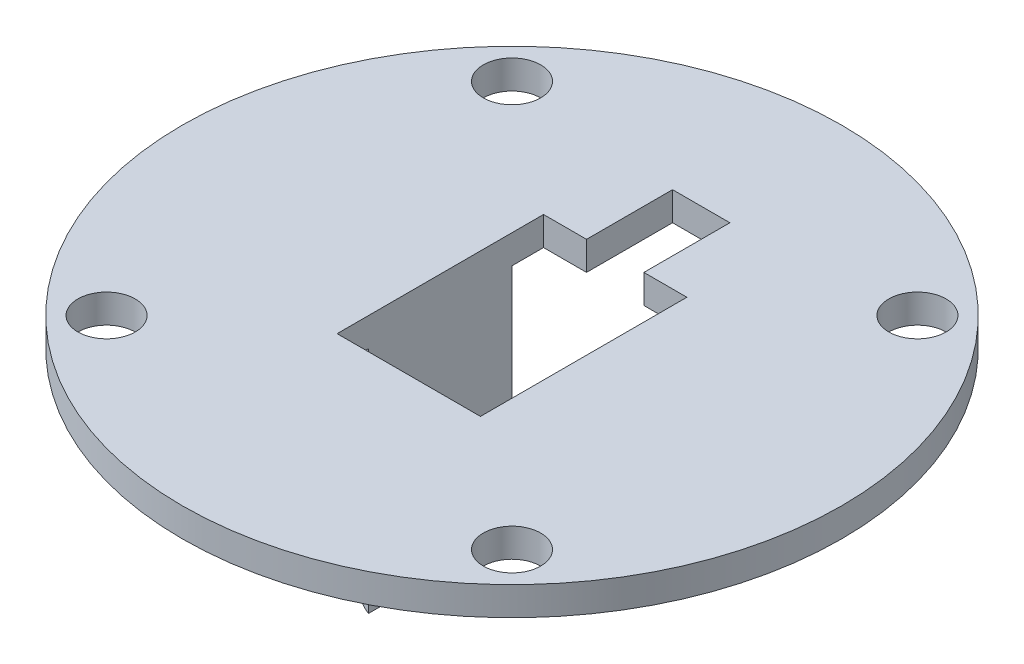
ISO-10303-21;
HEADER;
FILE_DESCRIPTION(('STEP AP214'),'2;1');
FILE_NAME('part.step','',(''),(''),'','','');
FILE_SCHEMA(('AUTOMOTIVE_DESIGN { 1 0 10303 214 1 1 1 1 }'));
ENDSEC;
DATA;
#1=APPLICATION_CONTEXT('core data for automotive mechanical design processes');
#2=APPLICATION_PROTOCOL_DEFINITION('international standard','automotive_design',2000,#1);
#3=PRODUCT_CONTEXT('',#1,'mechanical');
#4=PRODUCT('Part','Part','',(#3));
#5=PRODUCT_RELATED_PRODUCT_CATEGORY('part','',(#4));
#6=PRODUCT_DEFINITION_FORMATION('','',#4);
#7=PRODUCT_DEFINITION_CONTEXT('part definition',#1,'design');
#8=PRODUCT_DEFINITION('design','',#6,#7);
#9=PRODUCT_DEFINITION_SHAPE('','',#8);
#10=(LENGTH_UNIT() NAMED_UNIT(*) SI_UNIT(.MILLI.,.METRE.));
#11=(NAMED_UNIT(*) PLANE_ANGLE_UNIT() SI_UNIT($,.RADIAN.));
#12=(NAMED_UNIT(*) SI_UNIT($,.STERADIAN.) SOLID_ANGLE_UNIT());
#13=UNCERTAINTY_MEASURE_WITH_UNIT(LENGTH_MEASURE(1.E-05),#10,'distance_accuracy_value','');
#14=(GEOMETRIC_REPRESENTATION_CONTEXT(3) GLOBAL_UNCERTAINTY_ASSIGNED_CONTEXT((#13)) GLOBAL_UNIT_ASSIGNED_CONTEXT((#10,
#11,#12)) REPRESENTATION_CONTEXT('',''));
#15=CARTESIAN_POINT('',(0.,0.,0.));
#16=DIRECTION('',(0.,0.,1.));
#17=DIRECTION('',(1.,0.,0.));
#18=AXIS2_PLACEMENT_3D('',#15,#16,#17);
#19=CARTESIAN_POINT('',(-12.5,0.,-18.));
#20=DIRECTION('',(0.,0.,-1.));
#21=DIRECTION('',(-1.,0.,0.));
#22=AXIS2_PLACEMENT_3D('',#19,#20,#21);
#23=PLANE('',#22);
#24=DIRECTION('',(-1.,0.,0.));
#25=VECTOR('',#24,1.);
#26=CARTESIAN_POINT('',(-12.5,5.,-18.));
#27=LINE('',#26,#25);
#28=CARTESIAN_POINT('',(12.5,5.,-18.));
#29=VERTEX_POINT('',#28);
#30=CARTESIAN_POINT('',(5.,5.,-18.));
#31=VERTEX_POINT('',#30);
#32=EDGE_CURVE('E198',#29,#31,#27,.T.);
#33=ORIENTED_EDGE('',*,*,#32,.T.);
#34=DIRECTION('',(0.,-1.,0.));
#35=VECTOR('',#34,1.);
#36=CARTESIAN_POINT('',(5.,0.,-18.));
#37=LINE('',#36,#35);
#38=CARTESIAN_POINT('',(5.,0.,-18.));
#39=VERTEX_POINT('',#38);
#40=EDGE_CURVE('E11',#31,#39,#37,.T.);
#41=ORIENTED_EDGE('',*,*,#40,.T.);
#42=DIRECTION('',(-1.,0.,0.));
#43=VECTOR('',#42,1.);
#44=CARTESIAN_POINT('',(-12.5,0.,-18.));
#45=LINE('',#44,#43);
#46=CARTESIAN_POINT('',(12.5,0.,-18.));
#47=VERTEX_POINT('',#46);
#48=EDGE_CURVE('E186',#47,#39,#45,.T.);
#49=ORIENTED_EDGE('',*,*,#48,.F.);
#50=DIRECTION('',(0.,1.,0.));
#51=VECTOR('',#50,1.);
#52=CARTESIAN_POINT('',(12.5,0.,-18.));
#53=LINE('',#52,#51);
#54=EDGE_CURVE('E195',#47,#29,#53,.T.);
#55=ORIENTED_EDGE('',*,*,#54,.T.);
#56=EDGE_LOOP('',(#33,#41,#49,#55));
#57=FACE_BOUND('',#56,.T.);
#58=ADVANCED_FACE('F45',(#57),#23,.F.);
#59=CARTESIAN_POINT('',(0.,0.,0.));
#60=DIRECTION('',(0.,1.,0.));
#61=DIRECTION('',(0.,0.,1.));
#62=AXIS2_PLACEMENT_3D('',#59,#60,#61);
#63=PLANE('',#62);
#64=ORIENTED_EDGE('',*,*,#48,.T.);
#65=DIRECTION('',(0.,0.,-1.));
#66=VECTOR('',#65,1.);
#67=CARTESIAN_POINT('',(5.,0.,0.));
#68=LINE('',#67,#66);
#69=CARTESIAN_POINT('',(5.,0.,-33.));
#70=VERTEX_POINT('',#69);
#71=EDGE_CURVE('E164',#39,#70,#68,.T.);
#72=ORIENTED_EDGE('',*,*,#71,.T.);
#73=DIRECTION('',(-1.,0.,0.));
#74=VECTOR('',#73,1.);
#75=CARTESIAN_POINT('',(0.,0.,-33.));
#76=LINE('',#75,#74);
#77=CARTESIAN_POINT('',(-5.,0.,-33.));
#78=VERTEX_POINT('',#77);
#79=EDGE_CURVE('E142',#70,#78,#76,.T.);
#80=ORIENTED_EDGE('',*,*,#79,.T.);
#81=DIRECTION('',(0.,0.,1.));
#82=VECTOR('',#81,1.);
#83=CARTESIAN_POINT('',(-5.,0.,0.));
#84=LINE('',#83,#82);
#85=CARTESIAN_POINT('',(-5.,0.,-18.));
#86=VERTEX_POINT('',#85);
#87=EDGE_CURVE('E160',#78,#86,#84,.T.);
#88=ORIENTED_EDGE('',*,*,#87,.T.);
#89=CARTESIAN_POINT('',(-12.5,0.,-18.));
#90=VERTEX_POINT('',#89);
#91=EDGE_CURVE('E184',#86,#90,#45,.T.);
#92=ORIENTED_EDGE('',*,*,#91,.T.);
#93=DIRECTION('',(0.,0.,1.));
#94=VECTOR('',#93,1.);
#95=CARTESIAN_POINT('',(-12.5,0.,18.));
#96=LINE('',#95,#94);
#97=CARTESIAN_POINT('',(-12.5,0.,-12.5));
#98=VERTEX_POINT('',#97);
#99=EDGE_CURVE('E190',#90,#98,#96,.T.);
#100=ORIENTED_EDGE('',*,*,#99,.T.);
#101=CARTESIAN_POINT('',(-11.5,0.,-6.58392021690039));
#102=DIRECTION('',(0.,1.,0.));
#103=DIRECTION('',(0.,0.,1.));
#104=AXIS2_PLACEMENT_3D('',#101,#102,#103);
#105=CIRCLE('',#104,6.);
#106=CARTESIAN_POINT('',(-17.5,0.,-6.58392021690039));
#107=VERTEX_POINT('',#106);
#108=EDGE_CURVE('E249',#98,#107,#105,.T.);
#109=ORIENTED_EDGE('',*,*,#108,.T.);
#110=DIRECTION('',(0.,0.,-1.));
#111=VECTOR('',#110,1.);
#112=CARTESIAN_POINT('',(-17.5,0.,-12.5));
#113=LINE('',#112,#111);
#114=CARTESIAN_POINT('',(-17.5,0.,6.58392021690038));
#115=VERTEX_POINT('',#114);
#116=EDGE_CURVE('E172',#115,#107,#113,.T.);
#117=ORIENTED_EDGE('',*,*,#116,.F.);
#118=CARTESIAN_POINT('',(-11.5,0.,6.58392021690038));
#119=DIRECTION('',(0.,1.,0.));
#120=DIRECTION('',(0.,0.,1.));
#121=AXIS2_PLACEMENT_3D('',#118,#119,#120);
#122=CIRCLE('',#121,6.);
#123=CARTESIAN_POINT('',(-12.5,0.,12.5));
#124=VERTEX_POINT('',#123);
#125=EDGE_CURVE('E251',#115,#124,#122,.T.);
#126=ORIENTED_EDGE('',*,*,#125,.T.);
#127=CARTESIAN_POINT('',(-12.5,0.,18.));
#128=VERTEX_POINT('',#127);
#129=EDGE_CURVE('E189',#124,#128,#96,.T.);
#130=ORIENTED_EDGE('',*,*,#129,.T.);
#131=DIRECTION('',(1.,0.,0.));
#132=VECTOR('',#131,1.);
#133=CARTESIAN_POINT('',(-12.5,0.,18.));
#134=LINE('',#133,#132);
#135=CARTESIAN_POINT('',(12.5,0.,18.));
#136=VERTEX_POINT('',#135);
#137=EDGE_CURVE('E192',#128,#136,#134,.T.);
#138=ORIENTED_EDGE('',*,*,#137,.T.);
#139=DIRECTION('',(0.,0.,-1.));
#140=VECTOR('',#139,1.);
#141=CARTESIAN_POINT('',(12.5,0.,18.));
#142=LINE('',#141,#140);
#143=EDGE_CURVE('E181',#136,#47,#142,.T.);
#144=ORIENTED_EDGE('',*,*,#143,.T.);
#145=EDGE_LOOP('',(#64,#72,#80,#88,#92,#100,#109,#117,#126,#130,#138,#144));
#146=FACE_BOUND('',#145,.T.);
#147=CARTESIAN_POINT('',(0.,0.,0.));
#148=DIRECTION('',(0.,1.,0.));
#149=DIRECTION('',(0.,0.,1.));
#150=AXIS2_PLACEMENT_3D('',#147,#148,#149);
#151=CIRCLE('',#150,57.5);
#152=CARTESIAN_POINT('',(0.,0.,57.5));
#153=VERTEX_POINT('',#152);
#154=EDGE_CURVE('E236',#153,#153,#151,.T.);
#155=ORIENTED_EDGE('',*,*,#154,.F.);
#156=EDGE_LOOP('',(#155));
#157=FACE_BOUND('',#156,.T.);
#158=CARTESIAN_POINT('',(-35.3553390593274,0.,-35.3553390593274));
#159=DIRECTION('',(0.,1.,0.));
#160=DIRECTION('',(0.,0.,1.));
#161=AXIS2_PLACEMENT_3D('',#158,#159,#160);
#162=CIRCLE('',#161,5.);
#163=CARTESIAN_POINT('',(-35.3553390593274,0.,-30.3553390593274));
#164=VERTEX_POINT('',#163);
#165=EDGE_CURVE('E233',#164,#164,#162,.T.);
#166=ORIENTED_EDGE('',*,*,#165,.T.);
#167=EDGE_LOOP('',(#166));
#168=FACE_BOUND('',#167,.T.);
#169=CARTESIAN_POINT('',(35.3553390593274,0.,-35.3553390593274));
#170=DIRECTION('',(0.,1.,0.));
#171=DIRECTION('',(0.,0.,1.));
#172=AXIS2_PLACEMENT_3D('',#169,#170,#171);
#173=CIRCLE('',#172,5.);
#174=CARTESIAN_POINT('',(35.3553390593274,0.,-30.3553390593274));
#175=VERTEX_POINT('',#174);
#176=EDGE_CURVE('E219',#175,#175,#173,.T.);
#177=ORIENTED_EDGE('',*,*,#176,.T.);
#178=EDGE_LOOP('',(#177));
#179=FACE_BOUND('',#178,.T.);
#180=CARTESIAN_POINT('',(35.3553390593274,0.,35.3553390593274));
#181=DIRECTION('',(0.,1.,0.));
#182=DIRECTION('',(0.,0.,1.));
#183=AXIS2_PLACEMENT_3D('',#180,#181,#182);
#184=CIRCLE('',#183,5.);
#185=CARTESIAN_POINT('',(35.3553390593274,0.,40.3553390593274));
#186=VERTEX_POINT('',#185);
#187=EDGE_CURVE('E225',#186,#186,#184,.T.);
#188=ORIENTED_EDGE('',*,*,#187,.T.);
#189=EDGE_LOOP('',(#188));
#190=FACE_BOUND('',#189,.T.);
#191=CARTESIAN_POINT('',(-35.3553390593274,0.,35.3553390593274));
#192=DIRECTION('',(0.,1.,0.));
#193=DIRECTION('',(0.,0.,1.));
#194=AXIS2_PLACEMENT_3D('',#191,#192,#193);
#195=CIRCLE('',#194,5.);
#196=CARTESIAN_POINT('',(-35.3553390593274,0.,40.3553390593274));
#197=VERTEX_POINT('',#196);
#198=EDGE_CURVE('E207',#197,#197,#195,.T.);
#199=ORIENTED_EDGE('',*,*,#198,.T.);
#200=EDGE_LOOP('',(#199));
#201=FACE_BOUND('',#200,.T.);
#202=ADVANCED_FACE('F272',(#146,#157,#168,#179,#190,#201),#63,.F.);
#203=CARTESIAN_POINT('',(0.,5.,0.));
#204=DIRECTION('',(0.,-1.,0.));
#205=DIRECTION('',(0.,0.,-1.));
#206=AXIS2_PLACEMENT_3D('',#203,#204,#205);
#207=CYLINDRICAL_SURFACE('',#206,57.5);
#208=CARTESIAN_POINT('',(0.,5.,0.));
#209=DIRECTION('',(0.,1.,0.));
#210=DIRECTION('',(0.,0.,1.));
#211=AXIS2_PLACEMENT_3D('',#208,#209,#210);
#212=CIRCLE('',#211,57.5);
#213=CARTESIAN_POINT('',(0.,5.,57.5));
#214=VERTEX_POINT('',#213);
#215=EDGE_CURVE('E239',#214,#214,#212,.T.);
#216=ORIENTED_EDGE('',*,*,#215,.F.);
#217=EDGE_LOOP('',(#216));
#218=FACE_BOUND('',#217,.T.);
#219=ORIENTED_EDGE('',*,*,#154,.T.);
#220=EDGE_LOOP('',(#219));
#221=FACE_BOUND('',#220,.T.);
#222=ADVANCED_FACE('F290',(#218,#221),#207,.T.);
#223=CARTESIAN_POINT('',(0.,5.,0.));
#224=DIRECTION('',(0.,1.,0.));
#225=DIRECTION('',(0.,0.,1.));
#226=AXIS2_PLACEMENT_3D('',#223,#224,#225);
#227=PLANE('',#226);
#228=DIRECTION('',(0.,0.,-1.));
#229=VECTOR('',#228,1.);
#230=CARTESIAN_POINT('',(5.,5.,-18.));
#231=LINE('',#230,#229);
#232=CARTESIAN_POINT('',(5.,5.,-33.));
#233=VERTEX_POINT('',#232);
#234=EDGE_CURVE('E148',#31,#233,#231,.T.);
#235=ORIENTED_EDGE('',*,*,#234,.F.);
#236=ORIENTED_EDGE('',*,*,#32,.F.);
#237=DIRECTION('',(0.,0.,-1.));
#238=VECTOR('',#237,1.);
#239=CARTESIAN_POINT('',(12.5,5.,18.));
#240=LINE('',#239,#238);
#241=CARTESIAN_POINT('',(12.5,5.,18.));
#242=VERTEX_POINT('',#241);
#243=EDGE_CURVE('E180',#242,#29,#240,.T.);
#244=ORIENTED_EDGE('',*,*,#243,.F.);
#245=DIRECTION('',(1.,0.,0.));
#246=VECTOR('',#245,1.);
#247=CARTESIAN_POINT('',(-12.5,5.,18.));
#248=LINE('',#247,#246);
#249=CARTESIAN_POINT('',(-12.5,5.,18.));
#250=VERTEX_POINT('',#249);
#251=EDGE_CURVE('E185',#250,#242,#248,.T.);
#252=ORIENTED_EDGE('',*,*,#251,.F.);
#253=DIRECTION('',(0.,0.,1.));
#254=VECTOR('',#253,1.);
#255=CARTESIAN_POINT('',(-12.5,5.,18.));
#256=LINE('',#255,#254);
#257=CARTESIAN_POINT('',(-12.5,5.,-18.));
#258=VERTEX_POINT('',#257);
#259=EDGE_CURVE('E200',#258,#250,#256,.T.);
#260=ORIENTED_EDGE('',*,*,#259,.F.);
#261=CARTESIAN_POINT('',(-5.,5.,-18.));
#262=VERTEX_POINT('',#261);
#263=EDGE_CURVE('E197',#262,#258,#27,.T.);
#264=ORIENTED_EDGE('',*,*,#263,.F.);
#265=DIRECTION('',(0.,0.,1.));
#266=VECTOR('',#265,1.);
#267=CARTESIAN_POINT('',(-5.,5.,-18.));
#268=LINE('',#267,#266);
#269=CARTESIAN_POINT('',(-5.,5.,-33.));
#270=VERTEX_POINT('',#269);
#271=EDGE_CURVE('E60',#270,#262,#268,.T.);
#272=ORIENTED_EDGE('',*,*,#271,.F.);
#273=DIRECTION('',(-1.,0.,0.));
#274=VECTOR('',#273,1.);
#275=CARTESIAN_POINT('',(-5.,5.,-33.));
#276=LINE('',#275,#274);
#277=EDGE_CURVE('E140',#233,#270,#276,.T.);
#278=ORIENTED_EDGE('',*,*,#277,.F.);
#279=EDGE_LOOP('',(#235,#236,#244,#252,#260,#264,#272,#278));
#280=FACE_BOUND('',#279,.T.);
#281=CARTESIAN_POINT('',(-35.3553390593274,5.,35.3553390593274));
#282=DIRECTION('',(0.,1.,0.));
#283=DIRECTION('',(0.,0.,1.));
#284=AXIS2_PLACEMENT_3D('',#281,#282,#283);
#285=CIRCLE('',#284,5.);
#286=CARTESIAN_POINT('',(-35.3553390593274,5.,40.3553390593274));
#287=VERTEX_POINT('',#286);
#288=EDGE_CURVE('E228',#287,#287,#285,.T.);
#289=ORIENTED_EDGE('',*,*,#288,.F.);
#290=EDGE_LOOP('',(#289));
#291=FACE_BOUND('',#290,.T.);
#292=CARTESIAN_POINT('',(35.3553390593274,5.,35.3553390593274));
#293=DIRECTION('',(0.,1.,0.));
#294=DIRECTION('',(0.,0.,1.));
#295=AXIS2_PLACEMENT_3D('',#292,#293,#294);
#296=CIRCLE('',#295,5.);
#297=CARTESIAN_POINT('',(35.3553390593274,5.,40.3553390593274));
#298=VERTEX_POINT('',#297);
#299=EDGE_CURVE('E222',#298,#298,#296,.T.);
#300=ORIENTED_EDGE('',*,*,#299,.F.);
#301=EDGE_LOOP('',(#300));
#302=FACE_BOUND('',#301,.T.);
#303=CARTESIAN_POINT('',(35.3553390593274,5.,-35.3553390593274));
#304=DIRECTION('',(0.,1.,0.));
#305=DIRECTION('',(0.,0.,1.));
#306=AXIS2_PLACEMENT_3D('',#303,#304,#305);
#307=CIRCLE('',#306,5.);
#308=CARTESIAN_POINT('',(35.3553390593274,5.,-30.3553390593274));
#309=VERTEX_POINT('',#308);
#310=EDGE_CURVE('E215',#309,#309,#307,.T.);
#311=ORIENTED_EDGE('',*,*,#310,.F.);
#312=EDGE_LOOP('',(#311));
#313=FACE_BOUND('',#312,.T.);
#314=CARTESIAN_POINT('',(-35.3553390593274,5.,-35.3553390593274));
#315=DIRECTION('',(0.,1.,0.));
#316=DIRECTION('',(0.,0.,1.));
#317=AXIS2_PLACEMENT_3D('',#314,#315,#316);
#318=CIRCLE('',#317,5.);
#319=CARTESIAN_POINT('',(-35.3553390593274,5.,-30.3553390593274));
#320=VERTEX_POINT('',#319);
#321=EDGE_CURVE('E218',#320,#320,#318,.T.);
#322=ORIENTED_EDGE('',*,*,#321,.F.);
#323=EDGE_LOOP('',(#322));
#324=FACE_BOUND('',#323,.T.);
#325=ORIENTED_EDGE('',*,*,#215,.T.);
#326=EDGE_LOOP('',(#325));
#327=FACE_BOUND('',#326,.T.);
#328=ADVANCED_FACE('F154',(#280,#291,#302,#313,#324,#327),#227,.T.);
#329=CARTESIAN_POINT('',(-35.3553390593274,0.,-35.3553390593274));
#330=DIRECTION('',(0.,1.,0.));
#331=DIRECTION('',(0.,0.,1.));
#332=AXIS2_PLACEMENT_3D('',#329,#330,#331);
#333=CYLINDRICAL_SURFACE('',#332,5.);
#334=ORIENTED_EDGE('',*,*,#165,.F.);
#335=EDGE_LOOP('',(#334));
#336=FACE_BOUND('',#335,.T.);
#337=ORIENTED_EDGE('',*,*,#321,.T.);
#338=EDGE_LOOP('',(#337));
#339=FACE_BOUND('',#338,.T.);
#340=ADVANCED_FACE('F325',(#336,#339),#333,.F.);
#341=CARTESIAN_POINT('',(35.3553390593274,0.,-35.3553390593274));
#342=DIRECTION('',(0.,1.,0.));
#343=DIRECTION('',(0.,0.,1.));
#344=AXIS2_PLACEMENT_3D('',#341,#342,#343);
#345=CYLINDRICAL_SURFACE('',#344,5.);
#346=ORIENTED_EDGE('',*,*,#176,.F.);
#347=EDGE_LOOP('',(#346));
#348=FACE_BOUND('',#347,.T.);
#349=ORIENTED_EDGE('',*,*,#310,.T.);
#350=EDGE_LOOP('',(#349));
#351=FACE_BOUND('',#350,.T.);
#352=ADVANCED_FACE('F328',(#348,#351),#345,.F.);
#353=CARTESIAN_POINT('',(35.3553390593274,0.,35.3553390593274));
#354=DIRECTION('',(0.,1.,0.));
#355=DIRECTION('',(0.,0.,1.));
#356=AXIS2_PLACEMENT_3D('',#353,#354,#355);
#357=CYLINDRICAL_SURFACE('',#356,5.);
#358=ORIENTED_EDGE('',*,*,#187,.F.);
#359=EDGE_LOOP('',(#358));
#360=FACE_BOUND('',#359,.T.);
#361=ORIENTED_EDGE('',*,*,#299,.T.);
#362=EDGE_LOOP('',(#361));
#363=FACE_BOUND('',#362,.T.);
#364=ADVANCED_FACE('F333',(#360,#363),#357,.F.);
#365=CARTESIAN_POINT('',(-35.3553390593274,0.,35.3553390593274));
#366=DIRECTION('',(0.,1.,0.));
#367=DIRECTION('',(0.,0.,1.));
#368=AXIS2_PLACEMENT_3D('',#365,#366,#367);
#369=CYLINDRICAL_SURFACE('',#368,5.);
#370=ORIENTED_EDGE('',*,*,#198,.F.);
#371=EDGE_LOOP('',(#370));
#372=FACE_BOUND('',#371,.T.);
#373=ORIENTED_EDGE('',*,*,#288,.T.);
#374=EDGE_LOOP('',(#373));
#375=FACE_BOUND('',#374,.T.);
#376=ADVANCED_FACE('F330',(#372,#375),#369,.F.);
#377=CARTESIAN_POINT('',(12.5,0.,18.));
#378=DIRECTION('',(1.,0.,0.));
#379=DIRECTION('',(0.,0.,-1.));
#380=AXIS2_PLACEMENT_3D('',#377,#378,#379);
#381=PLANE('',#380);
#382=ORIENTED_EDGE('',*,*,#243,.T.);
#383=ORIENTED_EDGE('',*,*,#54,.F.);
#384=ORIENTED_EDGE('',*,*,#143,.F.);
#385=DIRECTION('',(0.,1.,0.));
#386=VECTOR('',#385,1.);
#387=CARTESIAN_POINT('',(12.5,0.,18.));
#388=LINE('',#387,#386);
#389=EDGE_CURVE('E205',#136,#242,#388,.T.);
#390=ORIENTED_EDGE('',*,*,#389,.T.);
#391=EDGE_LOOP('',(#382,#383,#384,#390));
#392=FACE_BOUND('',#391,.T.);
#393=ADVANCED_FACE('F307',(#392),#381,.F.);
#394=CARTESIAN_POINT('',(-12.5,0.,18.));
#395=DIRECTION('',(0.,0.,1.));
#396=DIRECTION('',(1.,0.,0.));
#397=AXIS2_PLACEMENT_3D('',#394,#395,#396);
#398=PLANE('',#397);
#399=ORIENTED_EDGE('',*,*,#251,.T.);
#400=ORIENTED_EDGE('',*,*,#389,.F.);
#401=ORIENTED_EDGE('',*,*,#137,.F.);
#402=DIRECTION('',(0.,1.,0.));
#403=VECTOR('',#402,1.);
#404=CARTESIAN_POINT('',(-12.5,0.,18.));
#405=LINE('',#404,#403);
#406=EDGE_CURVE('E208',#128,#250,#405,.T.);
#407=ORIENTED_EDGE('',*,*,#406,.T.);
#408=EDGE_LOOP('',(#399,#400,#401,#407));
#409=FACE_BOUND('',#408,.T.);
#410=ADVANCED_FACE('F303',(#409),#398,.F.);
#411=CARTESIAN_POINT('',(-12.5,0.,18.));
#412=DIRECTION('',(-1.,0.,0.));
#413=DIRECTION('',(0.,0.,1.));
#414=AXIS2_PLACEMENT_3D('',#411,#412,#413);
#415=PLANE('',#414);
#416=ORIENTED_EDGE('',*,*,#259,.T.);
#417=ORIENTED_EDGE('',*,*,#406,.F.);
#418=ORIENTED_EDGE('',*,*,#129,.F.);
#419=DIRECTION('',(0.,1.,0.));
#420=VECTOR('',#419,1.);
#421=CARTESIAN_POINT('',(-12.5,-40.,12.5));
#422=LINE('',#421,#420);
#423=CARTESIAN_POINT('',(-12.5,-40.,12.5));
#424=VERTEX_POINT('',#423);
#425=EDGE_CURVE('E177',#424,#124,#422,.T.);
#426=ORIENTED_EDGE('',*,*,#425,.F.);
#427=DIRECTION('',(0.,0.,1.));
#428=VECTOR('',#427,1.);
#429=CARTESIAN_POINT('',(-12.5,-40.,-12.5));
#430=LINE('',#429,#428);
#431=CARTESIAN_POINT('',(-12.5,-40.,-12.5));
#432=VERTEX_POINT('',#431);
#433=EDGE_CURVE('E168',#432,#424,#430,.T.);
#434=ORIENTED_EDGE('',*,*,#433,.F.);
#435=DIRECTION('',(0.,1.,0.));
#436=VECTOR('',#435,1.);
#437=CARTESIAN_POINT('',(-12.5,-40.,-12.5));
#438=LINE('',#437,#436);
#439=EDGE_CURVE('E171',#432,#98,#438,.T.);
#440=ORIENTED_EDGE('',*,*,#439,.T.);
#441=ORIENTED_EDGE('',*,*,#99,.F.);
#442=DIRECTION('',(0.,1.,0.));
#443=VECTOR('',#442,1.);
#444=CARTESIAN_POINT('',(-12.5,0.,-18.));
#445=LINE('',#444,#443);
#446=EDGE_CURVE('E210',#90,#258,#445,.T.);
#447=ORIENTED_EDGE('',*,*,#446,.T.);
#448=EDGE_LOOP('',(#416,#417,#418,#426,#434,#440,#441,#447));
#449=FACE_BOUND('',#448,.T.);
#450=ADVANCED_FACE('F264',(#449),#415,.F.);
#451=ORIENTED_EDGE('',*,*,#91,.F.);
#452=DIRECTION('',(0.,1.,0.));
#453=VECTOR('',#452,1.);
#454=CARTESIAN_POINT('',(-5.,0.,-18.));
#455=LINE('',#454,#453);
#456=EDGE_CURVE('E53',#86,#262,#455,.T.);
#457=ORIENTED_EDGE('',*,*,#456,.T.);
#458=ORIENTED_EDGE('',*,*,#263,.T.);
#459=ORIENTED_EDGE('',*,*,#446,.F.);
#460=EDGE_LOOP('',(#451,#457,#458,#459));
#461=FACE_BOUND('',#460,.T.);
#462=ADVANCED_FACE('F257',(#461),#23,.F.);
#463=CARTESIAN_POINT('',(-17.5,-40.,-12.5));
#464=DIRECTION('',(1.,0.,0.));
#465=DIRECTION('',(0.,0.,-1.));
#466=AXIS2_PLACEMENT_3D('',#463,#464,#465);
#467=PLANE('',#466);
#468=ORIENTED_EDGE('',*,*,#116,.T.);
#469=DIRECTION('',(0.,-1.,0.));
#470=VECTOR('',#469,1.);
#471=CARTESIAN_POINT('',(-17.5,-40.,-6.58392021690039));
#472=LINE('',#471,#470);
#473=CARTESIAN_POINT('',(-17.5,-34.0839202169004,-6.58392021690039));
#474=VERTEX_POINT('',#473);
#475=EDGE_CURVE('E68',#107,#474,#472,.T.);
#476=ORIENTED_EDGE('',*,*,#475,.T.);
#477=DIRECTION('',(0.,0.,1.));
#478=VECTOR('',#477,1.);
#479=CARTESIAN_POINT('',(-17.5,-34.0839202169004,-12.5));
#480=LINE('',#479,#478);
#481=CARTESIAN_POINT('',(-17.5,-34.0839202169004,6.58392021690038));
#482=VERTEX_POINT('',#481);
#483=EDGE_CURVE('E246',#474,#482,#480,.T.);
#484=ORIENTED_EDGE('',*,*,#483,.T.);
#485=DIRECTION('',(0.,1.,0.));
#486=VECTOR('',#485,1.);
#487=CARTESIAN_POINT('',(-17.5,-40.,6.58392021690038));
#488=LINE('',#487,#486);
#489=EDGE_CURVE('E242',#482,#115,#488,.T.);
#490=ORIENTED_EDGE('',*,*,#489,.T.);
#491=EDGE_LOOP('',(#468,#476,#484,#490));
#492=FACE_BOUND('',#491,.T.);
#493=ADVANCED_FACE('F295',(#492),#467,.F.);
#494=CARTESIAN_POINT('',(-11.5,-40.,6.58392021690038));
#495=DIRECTION('',(0.,1.,0.));
#496=DIRECTION('',(0.,0.,1.));
#497=AXIS2_PLACEMENT_3D('',#494,#495,#496);
#498=CYLINDRICAL_SURFACE('',#497,6.);
#499=ORIENTED_EDGE('',*,*,#125,.F.);
#500=ORIENTED_EDGE('',*,*,#489,.F.);
#501=CARTESIAN_POINT('',(-11.5,-34.0839202169004,6.58392021690038));
#502=DIRECTION('',(0.,0.707106781186547,0.707106781186547));
#503=DIRECTION('',(0.,0.707106781186547,-0.707106781186547));
#504=AXIS2_PLACEMENT_3D('',#501,#502,#503);
#505=ELLIPSE('',#504,8.48528137423857,6.);
#506=EDGE_CURVE('E174',#424,#482,#505,.F.);
#507=ORIENTED_EDGE('',*,*,#506,.F.);
#508=ORIENTED_EDGE('',*,*,#425,.T.);
#509=EDGE_LOOP('',(#499,#500,#507,#508));
#510=FACE_BOUND('',#509,.T.);
#511=ADVANCED_FACE('F47',(#510),#498,.T.);
#512=CARTESIAN_POINT('',(-11.5,-40.,-6.58392021690039));
#513=DIRECTION('',(0.,-1.,0.));
#514=DIRECTION('',(0.,0.,-1.));
#515=AXIS2_PLACEMENT_3D('',#512,#513,#514);
#516=CYLINDRICAL_SURFACE('',#515,6.);
#517=ORIENTED_EDGE('',*,*,#108,.F.);
#518=ORIENTED_EDGE('',*,*,#439,.F.);
#519=CARTESIAN_POINT('',(-11.5,-34.0839202169004,-6.58392021690039));
#520=DIRECTION('',(0.,-0.707106781186547,0.707106781186547));
#521=DIRECTION('',(0.,-0.707106781186547,-0.707106781186547));
#522=AXIS2_PLACEMENT_3D('',#519,#520,#521);
#523=ELLIPSE('',#522,8.48528137423857,6.);
#524=EDGE_CURVE('E167',#474,#432,#523,.T.);
#525=ORIENTED_EDGE('',*,*,#524,.F.);
#526=ORIENTED_EDGE('',*,*,#475,.F.);
#527=EDGE_LOOP('',(#517,#518,#525,#526));
#528=FACE_BOUND('',#527,.T.);
#529=ADVANCED_FACE('F313',(#528),#516,.T.);
#530=CARTESIAN_POINT('',(-11.5,-34.0839202169004,0.));
#531=DIRECTION('',(0.,0.,1.));
#532=DIRECTION('',(1.,0.,0.));
#533=AXIS2_PLACEMENT_3D('',#530,#531,#532);
#534=CYLINDRICAL_SURFACE('',#533,6.);
#535=ORIENTED_EDGE('',*,*,#506,.T.);
#536=ORIENTED_EDGE('',*,*,#483,.F.);
#537=ORIENTED_EDGE('',*,*,#524,.T.);
#538=ORIENTED_EDGE('',*,*,#433,.T.);
#539=EDGE_LOOP('',(#535,#536,#537,#538));
#540=FACE_BOUND('',#539,.T.);
#541=ADVANCED_FACE('F310',(#540),#534,.T.);
#542=CARTESIAN_POINT('',(-5.,-40.,-33.));
#543=DIRECTION('',(0.,0.,-1.));
#544=DIRECTION('',(-1.,0.,0.));
#545=AXIS2_PLACEMENT_3D('',#542,#543,#544);
#546=PLANE('',#545);
#547=DIRECTION('',(0.,1.,0.));
#548=VECTOR('',#547,1.);
#549=CARTESIAN_POINT('',(5.,-40.,-33.));
#550=LINE('',#549,#548);
#551=EDGE_CURVE('E135',#70,#233,#550,.T.);
#552=ORIENTED_EDGE('',*,*,#551,.T.);
#553=ORIENTED_EDGE('',*,*,#277,.T.);
#554=DIRECTION('',(0.,1.,0.));
#555=VECTOR('',#554,1.);
#556=CARTESIAN_POINT('',(-5.,-40.,-33.));
#557=LINE('',#556,#555);
#558=EDGE_CURVE('E145',#78,#270,#557,.T.);
#559=ORIENTED_EDGE('',*,*,#558,.F.);
#560=ORIENTED_EDGE('',*,*,#79,.F.);
#561=EDGE_LOOP('',(#552,#553,#559,#560));
#562=FACE_BOUND('',#561,.T.);
#563=ADVANCED_FACE('F137',(#562),#546,.F.);
#564=CARTESIAN_POINT('',(5.,-40.,-18.));
#565=DIRECTION('',(1.,0.,0.));
#566=DIRECTION('',(0.,0.,-1.));
#567=AXIS2_PLACEMENT_3D('',#564,#565,#566);
#568=PLANE('',#567);
#569=ORIENTED_EDGE('',*,*,#40,.F.);
#570=ORIENTED_EDGE('',*,*,#234,.T.);
#571=ORIENTED_EDGE('',*,*,#551,.F.);
#572=ORIENTED_EDGE('',*,*,#71,.F.);
#573=EDGE_LOOP('',(#569,#570,#571,#572));
#574=FACE_BOUND('',#573,.T.);
#575=ADVANCED_FACE('F149',(#574),#568,.F.);
#576=CARTESIAN_POINT('',(-5.,-40.,-18.));
#577=DIRECTION('',(-1.,0.,0.));
#578=DIRECTION('',(0.,0.,1.));
#579=AXIS2_PLACEMENT_3D('',#576,#577,#578);
#580=PLANE('',#579);
#581=ORIENTED_EDGE('',*,*,#558,.T.);
#582=ORIENTED_EDGE('',*,*,#271,.T.);
#583=ORIENTED_EDGE('',*,*,#456,.F.);
#584=ORIENTED_EDGE('',*,*,#87,.F.);
#585=EDGE_LOOP('',(#581,#582,#583,#584));
#586=FACE_BOUND('',#585,.T.);
#587=ADVANCED_FACE('F275',(#586),#580,.F.);
#588=CLOSED_SHELL('',(#58,#202,#222,#328,#340,#352,#364,#376,#393,#410,#450,#462,#493,#511,#529,
#541,#563,#575,#587));
#589=MANIFOLD_SOLID_BREP('B2',#588);
#590=ADVANCED_BREP_SHAPE_REPRESENTATION('',(#18,#589),#14);
#591=SHAPE_DEFINITION_REPRESENTATION(#9,#590);
ENDSEC;
END-ISO-10303-21;
